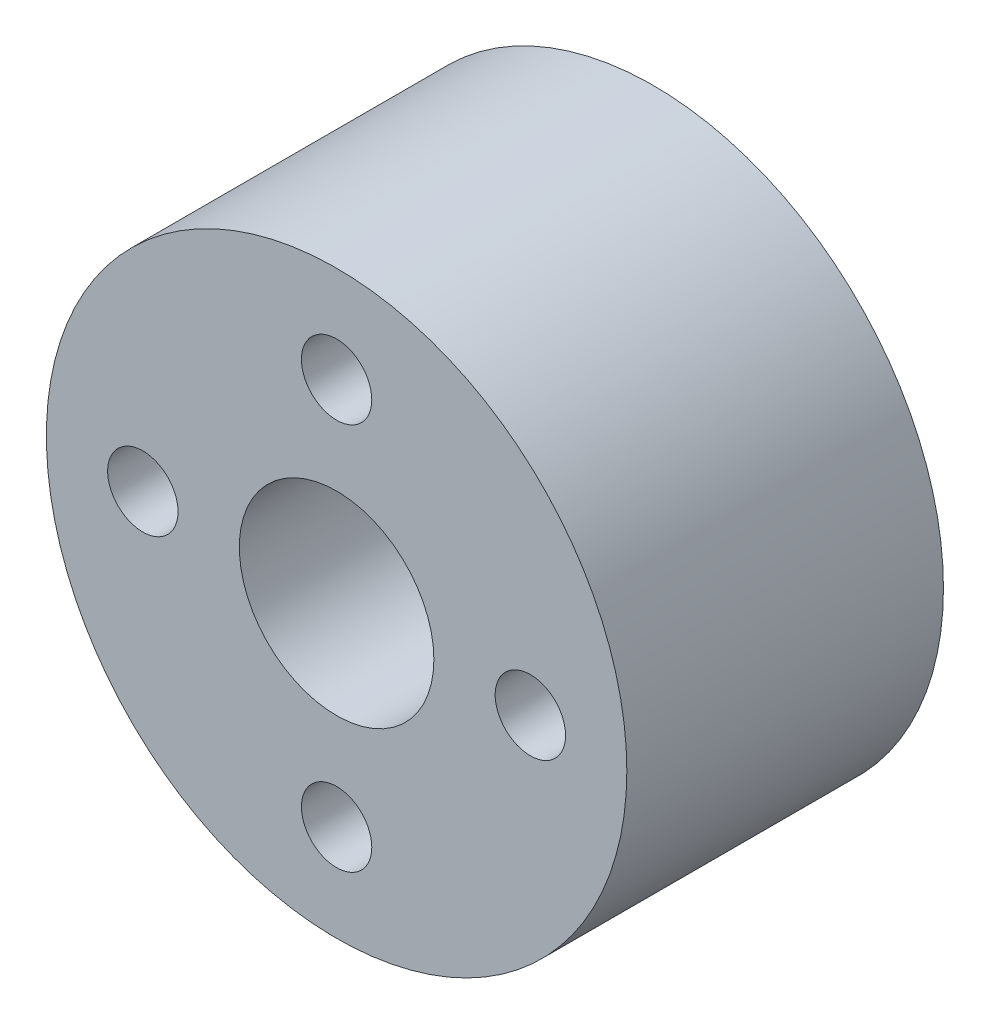
ISO-10303-21;
HEADER;
FILE_DESCRIPTION(('STEP AP214'),'2;1');
FILE_NAME('part.step','',(''),(''),'','','');
FILE_SCHEMA(('AUTOMOTIVE_DESIGN { 1 0 10303 214 1 1 1 1 }'));
ENDSEC;
DATA;
#1=APPLICATION_CONTEXT('core data for automotive mechanical design processes');
#2=APPLICATION_PROTOCOL_DEFINITION('international standard','automotive_design',2000,#1);
#3=PRODUCT_CONTEXT('',#1,'mechanical');
#4=PRODUCT('Part','Part','',(#3));
#5=PRODUCT_RELATED_PRODUCT_CATEGORY('part','',(#4));
#6=PRODUCT_DEFINITION_FORMATION('','',#4);
#7=PRODUCT_DEFINITION_CONTEXT('part definition',#1,'design');
#8=PRODUCT_DEFINITION('design','',#6,#7);
#9=PRODUCT_DEFINITION_SHAPE('','',#8);
#10=(LENGTH_UNIT() NAMED_UNIT(*) SI_UNIT(.MILLI.,.METRE.));
#11=(NAMED_UNIT(*) PLANE_ANGLE_UNIT() SI_UNIT($,.RADIAN.));
#12=(NAMED_UNIT(*) SI_UNIT($,.STERADIAN.) SOLID_ANGLE_UNIT());
#13=UNCERTAINTY_MEASURE_WITH_UNIT(LENGTH_MEASURE(1.E-05),#10,'distance_accuracy_value','');
#14=(GEOMETRIC_REPRESENTATION_CONTEXT(3) GLOBAL_UNCERTAINTY_ASSIGNED_CONTEXT((#13)) GLOBAL_UNIT_ASSIGNED_CONTEXT((#10,
#11,#12)) REPRESENTATION_CONTEXT('',''));
#15=CARTESIAN_POINT('',(0.,0.,0.));
#16=DIRECTION('',(0.,0.,1.));
#17=DIRECTION('',(1.,0.,0.));
#18=AXIS2_PLACEMENT_3D('',#15,#16,#17);
#19=CARTESIAN_POINT('',(0.,0.,-38.1));
#20=DIRECTION('',(0.,0.,1.));
#21=DIRECTION('',(1.,0.,0.));
#22=AXIS2_PLACEMENT_3D('',#19,#20,#21);
#23=CYLINDRICAL_SURFACE('',#22,69.85);
#24=CARTESIAN_POINT('',(0.,0.,-38.1));
#25=DIRECTION('',(0.,0.,1.));
#26=DIRECTION('',(1.,0.,0.));
#27=AXIS2_PLACEMENT_3D('',#24,#25,#26);
#28=CIRCLE('',#27,69.85);
#29=CARTESIAN_POINT('',(69.85,0.,-38.1));
#30=VERTEX_POINT('',#29);
#31=EDGE_CURVE('E12',#30,#30,#28,.T.);
#32=CARTESIAN_POINT('',(0.,0.,38.1));
#33=DIRECTION('',(0.,0.,1.));
#34=DIRECTION('',(1.,0.,0.));
#35=AXIS2_PLACEMENT_3D('',#32,#33,#34);
#36=CIRCLE('',#35,69.85);
#37=CARTESIAN_POINT('',(69.85,0.,38.1));
#38=VERTEX_POINT('',#37);
#39=EDGE_CURVE('E65',#38,#38,#36,.T.);
#40=CARTESIAN_POINT('',(69.85,0.,-38.1));
#41=CARTESIAN_POINT('',(69.85,0.,-37.30625));
#42=CARTESIAN_POINT('',(69.85,0.,-36.5125));
#43=CARTESIAN_POINT('',(69.85,0.,-34.925));
#44=CARTESIAN_POINT('',(69.85,0.,-34.13125));
#45=CARTESIAN_POINT('',(69.85,0.,-32.54375));
#46=CARTESIAN_POINT('',(69.85,0.,-31.75));
#47=CARTESIAN_POINT('',(69.85,0.,-30.1625));
#48=CARTESIAN_POINT('',(69.85,0.,-29.36875));
#49=CARTESIAN_POINT('',(69.85,0.,-27.78125));
#50=CARTESIAN_POINT('',(69.85,0.,-26.9875));
#51=CARTESIAN_POINT('',(69.85,0.,-25.4));
#52=CARTESIAN_POINT('',(69.85,0.,-24.60625));
#53=CARTESIAN_POINT('',(69.85,0.,-23.01875));
#54=CARTESIAN_POINT('',(69.85,0.,-22.225));
#55=CARTESIAN_POINT('',(69.85,0.,-20.6375));
#56=CARTESIAN_POINT('',(69.85,0.,-19.84375));
#57=CARTESIAN_POINT('',(69.85,0.,-18.25625));
#58=CARTESIAN_POINT('',(69.85,0.,-17.4625));
#59=CARTESIAN_POINT('',(69.85,0.,-15.875));
#60=CARTESIAN_POINT('',(69.85,0.,-15.08125));
#61=CARTESIAN_POINT('',(69.85,0.,-13.49375));
#62=CARTESIAN_POINT('',(69.85,0.,-12.7));
#63=CARTESIAN_POINT('',(69.85,0.,-11.1125));
#64=CARTESIAN_POINT('',(69.85,0.,-10.31875));
#65=CARTESIAN_POINT('',(69.85,0.,-8.73125));
#66=CARTESIAN_POINT('',(69.85,0.,-7.9375));
#67=CARTESIAN_POINT('',(69.85,0.,-6.35));
#68=CARTESIAN_POINT('',(69.85,0.,-5.55625000000001));
#69=CARTESIAN_POINT('',(69.85,0.,-3.96875000000001));
#70=CARTESIAN_POINT('',(69.85,0.,-3.17500000000001));
#71=CARTESIAN_POINT('',(69.85,0.,-1.58750000000001));
#72=CARTESIAN_POINT('',(69.85,0.,-0.793750000000007));
#73=CARTESIAN_POINT('',(69.85,0.,0.793749999999994));
#74=CARTESIAN_POINT('',(69.85,0.,1.58749999999999));
#75=CARTESIAN_POINT('',(69.85,0.,3.17499999999999));
#76=CARTESIAN_POINT('',(69.85,0.,3.96875));
#77=CARTESIAN_POINT('',(69.85,0.,5.55625));
#78=CARTESIAN_POINT('',(69.85,0.,6.35));
#79=CARTESIAN_POINT('',(69.85,0.,7.9375));
#80=CARTESIAN_POINT('',(69.85,0.,8.73125));
#81=CARTESIAN_POINT('',(69.85,0.,10.31875));
#82=CARTESIAN_POINT('',(69.85,0.,11.1125));
#83=CARTESIAN_POINT('',(69.85,0.,12.7));
#84=CARTESIAN_POINT('',(69.85,0.,13.49375));
#85=CARTESIAN_POINT('',(69.85,0.,15.08125));
#86=CARTESIAN_POINT('',(69.85,0.,15.875));
#87=CARTESIAN_POINT('',(69.85,0.,17.4625));
#88=CARTESIAN_POINT('',(69.85,0.,18.25625));
#89=CARTESIAN_POINT('',(69.85,0.,19.84375));
#90=CARTESIAN_POINT('',(69.85,0.,20.6375));
#91=CARTESIAN_POINT('',(69.85,0.,22.225));
#92=CARTESIAN_POINT('',(69.85,0.,23.01875));
#93=CARTESIAN_POINT('',(69.85,0.,24.60625));
#94=CARTESIAN_POINT('',(69.85,0.,25.4));
#95=CARTESIAN_POINT('',(69.85,0.,26.9875));
#96=CARTESIAN_POINT('',(69.85,0.,27.78125));
#97=CARTESIAN_POINT('',(69.85,0.,29.36875));
#98=CARTESIAN_POINT('',(69.85,0.,30.1625));
#99=CARTESIAN_POINT('',(69.85,0.,31.75));
#100=CARTESIAN_POINT('',(69.85,0.,32.54375));
#101=CARTESIAN_POINT('',(69.85,0.,34.13125));
#102=CARTESIAN_POINT('',(69.85,0.,34.925));
#103=CARTESIAN_POINT('',(69.85,0.,36.5125));
#104=CARTESIAN_POINT('',(69.85,0.,37.30625));
#105=CARTESIAN_POINT('',(69.85,0.,38.1));
#106=B_SPLINE_CURVE_WITH_KNOTS('',3,(#40,#41,#42,#43,#44,#45,#46,#47,#48,#49,#50,#51,#52,#53,
#54,#55,#56,#57,#58,#59,#60,#61,#62,#63,#64,#65,#66,#67,#68,#69,#70,#71,#72,#73,#74,#75,#76,#77,
#78,#79,#80,#81,#82,#83,#84,#85,#86,#87,#88,#89,#90,#91,#92,#93,#94,#95,#96,#97,#98,#99,#100,
#101,#102,#103,#104,#105),.UNSPECIFIED.,.F.,.F.,(4,2,2,2,2,2,2,2,2,2,2,2,2,2,2,2,2,2,2,2,2,2,2,
2,2,2,2,2,2,2,2,2,4),(0.,2.38125,4.7625,7.14375,9.52500000000001,11.90625,14.2875,16.66875,
19.05,21.43125,23.8125,26.19375,28.575,30.95625,33.3375,35.71875,38.1,40.48125,42.8625,45.24375,
47.625,50.00625,52.3875,54.76875,57.15,59.53125,61.9125,64.29375,66.675,69.05625,71.4375,
73.81875,76.2),.UNSPECIFIED.);
#107=EDGE_CURVE('BSEAM40',#30,#38,#106,.T.);
#108=ORIENTED_EDGE('',*,*,#31,.T.);
#109=ORIENTED_EDGE('',*,*,#39,.F.);
#110=ORIENTED_EDGE('',*,*,#107,.T.);
#111=ORIENTED_EDGE('',*,*,#107,.F.);
#112=EDGE_LOOP('',(#108,#110,#109,#111));
#113=FACE_BOUND('',#112,.T.);
#114=ADVANCED_FACE('F40',(#113),#23,.T.);
#115=CARTESIAN_POINT('',(0.,0.,-38.1));
#116=DIRECTION('',(0.,0.,1.));
#117=DIRECTION('',(1.,0.,0.));
#118=AXIS2_PLACEMENT_3D('',#115,#116,#117);
#119=PLANE('',#118);
#120=CARTESIAN_POINT('',(-4.74992845568246E-13,-46.631301073,-38.1));
#121=DIRECTION('',(0.,0.,1.));
#122=DIRECTION('',(1.,0.,0.));
#123=AXIS2_PLACEMENT_3D('',#120,#121,#122);
#124=CIRCLE('',#123,8.46666666666666);
#125=CARTESIAN_POINT('',(8.46666666666619,-46.631301073,-38.1));
#126=VERTEX_POINT('',#125);
#127=EDGE_CURVE('E62',#126,#126,#124,.T.);
#128=ORIENTED_EDGE('',*,*,#127,.T.);
#129=EDGE_LOOP('',(#128));
#130=FACE_BOUND('',#129,.T.);
#131=CARTESIAN_POINT('',(46.631301073,-3.1218052806589E-13,-38.1));
#132=DIRECTION('',(0.,0.,1.));
#133=DIRECTION('',(1.,0.,0.));
#134=AXIS2_PLACEMENT_3D('',#131,#132,#133);
#135=CIRCLE('',#134,8.46666666666666);
#136=CARTESIAN_POINT('',(55.0979677396667,-3.1218052806589E-13,-38.1));
#137=VERTEX_POINT('',#136);
#138=EDGE_CURVE('E59',#137,#137,#135,.T.);
#139=ORIENTED_EDGE('',*,*,#138,.T.);
#140=EDGE_LOOP('',(#139));
#141=FACE_BOUND('',#140,.T.);
#142=CARTESIAN_POINT('',(1.56307104467442E-13,46.631301073,-38.1));
#143=DIRECTION('',(0.,0.,1.));
#144=DIRECTION('',(1.,0.,0.));
#145=AXIS2_PLACEMENT_3D('',#142,#143,#144);
#146=CIRCLE('',#145,8.46666666666666);
#147=CARTESIAN_POINT('',(8.46666666666681,46.631301073,-38.1));
#148=VERTEX_POINT('',#147);
#149=EDGE_CURVE('E54',#148,#148,#146,.T.);
#150=ORIENTED_EDGE('',*,*,#149,.T.);
#151=EDGE_LOOP('',(#150));
#152=FACE_BOUND('',#151,.T.);
#153=CARTESIAN_POINT('',(-46.631301073,0.,-38.1));
#154=DIRECTION('',(0.,0.,1.));
#155=DIRECTION('',(1.,0.,0.));
#156=AXIS2_PLACEMENT_3D('',#153,#154,#155);
#157=CIRCLE('',#156,8.46666666666666);
#158=CARTESIAN_POINT('',(-38.1646344063333,0.,-38.1));
#159=VERTEX_POINT('',#158);
#160=EDGE_CURVE('E50',#159,#159,#157,.T.);
#161=ORIENTED_EDGE('',*,*,#160,.T.);
#162=EDGE_LOOP('',(#161));
#163=FACE_BOUND('',#162,.T.);
#164=CARTESIAN_POINT('',(0.,0.,-38.1));
#165=DIRECTION('',(0.,0.,1.));
#166=DIRECTION('',(1.,0.,0.));
#167=AXIS2_PLACEMENT_3D('',#164,#165,#166);
#168=CIRCLE('',#167,23.412602146);
#169=CARTESIAN_POINT('',(23.412602146,0.,-38.1));
#170=VERTEX_POINT('',#169);
#171=EDGE_CURVE('E46',#170,#170,#168,.T.);
#172=ORIENTED_EDGE('',*,*,#171,.T.);
#173=EDGE_LOOP('',(#172));
#174=FACE_BOUND('',#173,.T.);
#175=ORIENTED_EDGE('',*,*,#31,.F.);
#176=EDGE_LOOP('',(#175));
#177=FACE_BOUND('',#176,.T.);
#178=ADVANCED_FACE('F99',(#130,#141,#152,#163,#174,#177),#119,.F.);
#179=CARTESIAN_POINT('',(0.,0.,-38.1));
#180=DIRECTION('',(0.,0.,1.));
#181=DIRECTION('',(1.,0.,0.));
#182=AXIS2_PLACEMENT_3D('',#179,#180,#181);
#183=CYLINDRICAL_SURFACE('',#182,23.412602146);
#184=CARTESIAN_POINT('',(0.,0.,38.1));
#185=DIRECTION('',(0.,0.,1.));
#186=DIRECTION('',(1.,0.,0.));
#187=AXIS2_PLACEMENT_3D('',#184,#185,#186);
#188=CIRCLE('',#187,23.412602146);
#189=CARTESIAN_POINT('',(23.412602146,0.,38.1));
#190=VERTEX_POINT('',#189);
#191=EDGE_CURVE('E68',#190,#190,#188,.T.);
#192=CARTESIAN_POINT('',(23.412602146,0.,-38.1));
#193=CARTESIAN_POINT('',(23.412602146,0.,-37.30625));
#194=CARTESIAN_POINT('',(23.412602146,0.,-36.5125));
#195=CARTESIAN_POINT('',(23.412602146,0.,-34.925));
#196=CARTESIAN_POINT('',(23.412602146,0.,-34.13125));
#197=CARTESIAN_POINT('',(23.412602146,0.,-32.54375));
#198=CARTESIAN_POINT('',(23.412602146,0.,-31.75));
#199=CARTESIAN_POINT('',(23.412602146,0.,-30.1625));
#200=CARTESIAN_POINT('',(23.412602146,0.,-29.36875));
#201=CARTESIAN_POINT('',(23.412602146,0.,-27.78125));
#202=CARTESIAN_POINT('',(23.412602146,0.,-26.9875));
#203=CARTESIAN_POINT('',(23.412602146,0.,-25.4));
#204=CARTESIAN_POINT('',(23.412602146,0.,-24.60625));
#205=CARTESIAN_POINT('',(23.412602146,0.,-23.01875));
#206=CARTESIAN_POINT('',(23.412602146,0.,-22.225));
#207=CARTESIAN_POINT('',(23.412602146,0.,-20.6375));
#208=CARTESIAN_POINT('',(23.412602146,0.,-19.84375));
#209=CARTESIAN_POINT('',(23.412602146,0.,-18.25625));
#210=CARTESIAN_POINT('',(23.412602146,0.,-17.4625));
#211=CARTESIAN_POINT('',(23.412602146,0.,-15.875));
#212=CARTESIAN_POINT('',(23.412602146,0.,-15.08125));
#213=CARTESIAN_POINT('',(23.412602146,0.,-13.49375));
#214=CARTESIAN_POINT('',(23.412602146,0.,-12.7));
#215=CARTESIAN_POINT('',(23.412602146,0.,-11.1125));
#216=CARTESIAN_POINT('',(23.412602146,0.,-10.31875));
#217=CARTESIAN_POINT('',(23.412602146,0.,-8.73125));
#218=CARTESIAN_POINT('',(23.412602146,0.,-7.9375));
#219=CARTESIAN_POINT('',(23.412602146,0.,-6.35));
#220=CARTESIAN_POINT('',(23.412602146,0.,-5.55625));
#221=CARTESIAN_POINT('',(23.412602146,0.,-3.96875));
#222=CARTESIAN_POINT('',(23.412602146,0.,-3.175));
#223=CARTESIAN_POINT('',(23.412602146,0.,-1.5875));
#224=CARTESIAN_POINT('',(23.412602146,0.,-0.793750000000001));
#225=CARTESIAN_POINT('',(23.412602146,0.,0.793750000000001));
#226=CARTESIAN_POINT('',(23.412602146,0.,1.5875));
#227=CARTESIAN_POINT('',(23.412602146,0.,3.175));
#228=CARTESIAN_POINT('',(23.412602146,0.,3.96875));
#229=CARTESIAN_POINT('',(23.412602146,0.,5.55625));
#230=CARTESIAN_POINT('',(23.412602146,0.,6.35));
#231=CARTESIAN_POINT('',(23.412602146,0.,7.93750000000001));
#232=CARTESIAN_POINT('',(23.412602146,0.,8.73125));
#233=CARTESIAN_POINT('',(23.412602146,0.,10.31875));
#234=CARTESIAN_POINT('',(23.412602146,0.,11.1125));
#235=CARTESIAN_POINT('',(23.412602146,0.,12.7));
#236=CARTESIAN_POINT('',(23.412602146,0.,13.49375));
#237=CARTESIAN_POINT('',(23.412602146,0.,15.08125));
#238=CARTESIAN_POINT('',(23.412602146,0.,15.875));
#239=CARTESIAN_POINT('',(23.412602146,0.,17.4625));
#240=CARTESIAN_POINT('',(23.412602146,0.,18.25625));
#241=CARTESIAN_POINT('',(23.412602146,0.,19.84375));
#242=CARTESIAN_POINT('',(23.412602146,0.,20.6375));
#243=CARTESIAN_POINT('',(23.412602146,0.,22.225));
#244=CARTESIAN_POINT('',(23.412602146,0.,23.01875));
#245=CARTESIAN_POINT('',(23.412602146,0.,24.60625));
#246=CARTESIAN_POINT('',(23.412602146,0.,25.4));
#247=CARTESIAN_POINT('',(23.412602146,0.,26.9875));
#248=CARTESIAN_POINT('',(23.412602146,0.,27.78125));
#249=CARTESIAN_POINT('',(23.412602146,0.,29.36875));
#250=CARTESIAN_POINT('',(23.412602146,0.,30.1625));
#251=CARTESIAN_POINT('',(23.412602146,0.,31.75));
#252=CARTESIAN_POINT('',(23.412602146,0.,32.54375));
#253=CARTESIAN_POINT('',(23.412602146,0.,34.13125));
#254=CARTESIAN_POINT('',(23.412602146,0.,34.925));
#255=CARTESIAN_POINT('',(23.412602146,0.,36.5125));
#256=CARTESIAN_POINT('',(23.412602146,0.,37.30625));
#257=CARTESIAN_POINT('',(23.412602146,0.,38.1));
#258=B_SPLINE_CURVE_WITH_KNOTS('',3,(#192,#193,#194,#195,#196,#197,#198,#199,#200,#201,#202,
#203,#204,#205,#206,#207,#208,#209,#210,#211,#212,#213,#214,#215,#216,#217,#218,#219,#220,#221,
#222,#223,#224,#225,#226,#227,#228,#229,#230,#231,#232,#233,#234,#235,#236,#237,#238,#239,#240,
#241,#242,#243,#244,#245,#246,#247,#248,#249,#250,#251,#252,#253,#254,#255,#256,#257),
.UNSPECIFIED.,.F.,.F.,(4,2,2,2,2,2,2,2,2,2,2,2,2,2,2,2,2,2,2,2,2,2,2,2,2,2,2,2,2,2,2,2,4),(0.,
2.38124999999999,4.7625,7.14375,9.525,11.90625,14.2875,16.66875,19.05,21.43125,23.8125,26.19375,
28.575,30.95625,33.3375,35.71875,38.1,40.48125,42.8625,45.24375,47.625,50.00625,52.3875,
54.76875,57.15,59.53125,61.9125,64.29375,66.675,69.05625,71.4375,73.81875,76.2),.UNSPECIFIED.);
#259=EDGE_CURVE('BSEAM103',#170,#190,#258,.T.);
#260=ORIENTED_EDGE('',*,*,#171,.F.);
#261=ORIENTED_EDGE('',*,*,#191,.T.);
#262=ORIENTED_EDGE('',*,*,#259,.T.);
#263=ORIENTED_EDGE('',*,*,#259,.F.);
#264=EDGE_LOOP('',(#260,#262,#261,#263));
#265=FACE_BOUND('',#264,.T.);
#266=ADVANCED_FACE('F103',(#265),#183,.F.);
#267=CARTESIAN_POINT('',(-46.631301073,0.,-38.1));
#268=DIRECTION('',(0.,0.,1.));
#269=DIRECTION('',(1.,0.,0.));
#270=AXIS2_PLACEMENT_3D('',#267,#268,#269);
#271=CYLINDRICAL_SURFACE('',#270,8.46666666666666);
#272=CARTESIAN_POINT('',(-46.631301073,0.,38.1));
#273=DIRECTION('',(0.,0.,1.));
#274=DIRECTION('',(1.,0.,0.));
#275=AXIS2_PLACEMENT_3D('',#272,#273,#274);
#276=CIRCLE('',#275,8.46666666666666);
#277=CARTESIAN_POINT('',(-38.1646344063333,0.,38.1));
#278=VERTEX_POINT('',#277);
#279=EDGE_CURVE('E71',#278,#278,#276,.T.);
#280=CARTESIAN_POINT('',(-38.1646344063333,0.,-38.1));
#281=CARTESIAN_POINT('',(-38.1646344063333,0.,-37.30625));
#282=CARTESIAN_POINT('',(-38.1646344063333,0.,-36.5125));
#283=CARTESIAN_POINT('',(-38.1646344063333,0.,-34.925));
#284=CARTESIAN_POINT('',(-38.1646344063333,0.,-34.13125));
#285=CARTESIAN_POINT('',(-38.1646344063333,0.,-32.54375));
#286=CARTESIAN_POINT('',(-38.1646344063333,0.,-31.75));
#287=CARTESIAN_POINT('',(-38.1646344063333,0.,-30.1625));
#288=CARTESIAN_POINT('',(-38.1646344063333,0.,-29.36875));
#289=CARTESIAN_POINT('',(-38.1646344063333,0.,-27.78125));
#290=CARTESIAN_POINT('',(-38.1646344063333,0.,-26.9875));
#291=CARTESIAN_POINT('',(-38.1646344063333,0.,-25.4));
#292=CARTESIAN_POINT('',(-38.1646344063333,0.,-24.60625));
#293=CARTESIAN_POINT('',(-38.1646344063333,0.,-23.01875));
#294=CARTESIAN_POINT('',(-38.1646344063333,0.,-22.225));
#295=CARTESIAN_POINT('',(-38.1646344063333,0.,-20.6375));
#296=CARTESIAN_POINT('',(-38.1646344063333,0.,-19.84375));
#297=CARTESIAN_POINT('',(-38.1646344063333,0.,-18.25625));
#298=CARTESIAN_POINT('',(-38.1646344063333,0.,-17.4625));
#299=CARTESIAN_POINT('',(-38.1646344063333,0.,-15.875));
#300=CARTESIAN_POINT('',(-38.1646344063333,0.,-15.08125));
#301=CARTESIAN_POINT('',(-38.1646344063333,0.,-13.49375));
#302=CARTESIAN_POINT('',(-38.1646344063333,0.,-12.7));
#303=CARTESIAN_POINT('',(-38.1646344063333,0.,-11.1125));
#304=CARTESIAN_POINT('',(-38.1646344063333,0.,-10.31875));
#305=CARTESIAN_POINT('',(-38.1646344063333,0.,-8.73125));
#306=CARTESIAN_POINT('',(-38.1646344063333,0.,-7.9375));
#307=CARTESIAN_POINT('',(-38.1646344063333,0.,-6.35));
#308=CARTESIAN_POINT('',(-38.1646344063333,0.,-5.55625000000001));
#309=CARTESIAN_POINT('',(-38.1646344063333,0.,-3.96875000000001));
#310=CARTESIAN_POINT('',(-38.1646344063333,0.,-3.17500000000001));
#311=CARTESIAN_POINT('',(-38.1646344063333,0.,-1.58750000000001));
#312=CARTESIAN_POINT('',(-38.1646344063333,0.,-0.793750000000007));
#313=CARTESIAN_POINT('',(-38.1646344063333,0.,0.793749999999994));
#314=CARTESIAN_POINT('',(-38.1646344063333,0.,1.58749999999999));
#315=CARTESIAN_POINT('',(-38.1646344063333,0.,3.17499999999999));
#316=CARTESIAN_POINT('',(-38.1646344063333,0.,3.96875));
#317=CARTESIAN_POINT('',(-38.1646344063333,0.,5.55625));
#318=CARTESIAN_POINT('',(-38.1646344063333,0.,6.35));
#319=CARTESIAN_POINT('',(-38.1646344063333,0.,7.9375));
#320=CARTESIAN_POINT('',(-38.1646344063333,0.,8.73125));
#321=CARTESIAN_POINT('',(-38.1646344063333,0.,10.31875));
#322=CARTESIAN_POINT('',(-38.1646344063333,0.,11.1125));
#323=CARTESIAN_POINT('',(-38.1646344063333,0.,12.7));
#324=CARTESIAN_POINT('',(-38.1646344063333,0.,13.49375));
#325=CARTESIAN_POINT('',(-38.1646344063333,0.,15.08125));
#326=CARTESIAN_POINT('',(-38.1646344063333,0.,15.875));
#327=CARTESIAN_POINT('',(-38.1646344063333,0.,17.4625));
#328=CARTESIAN_POINT('',(-38.1646344063333,0.,18.25625));
#329=CARTESIAN_POINT('',(-38.1646344063333,0.,19.84375));
#330=CARTESIAN_POINT('',(-38.1646344063333,0.,20.6375));
#331=CARTESIAN_POINT('',(-38.1646344063333,0.,22.225));
#332=CARTESIAN_POINT('',(-38.1646344063333,0.,23.01875));
#333=CARTESIAN_POINT('',(-38.1646344063333,0.,24.60625));
#334=CARTESIAN_POINT('',(-38.1646344063333,0.,25.4));
#335=CARTESIAN_POINT('',(-38.1646344063333,0.,26.9875));
#336=CARTESIAN_POINT('',(-38.1646344063333,0.,27.78125));
#337=CARTESIAN_POINT('',(-38.1646344063333,0.,29.36875));
#338=CARTESIAN_POINT('',(-38.1646344063333,0.,30.1625));
#339=CARTESIAN_POINT('',(-38.1646344063333,0.,31.75));
#340=CARTESIAN_POINT('',(-38.1646344063333,0.,32.54375));
#341=CARTESIAN_POINT('',(-38.1646344063333,0.,34.13125));
#342=CARTESIAN_POINT('',(-38.1646344063333,0.,34.925));
#343=CARTESIAN_POINT('',(-38.1646344063333,0.,36.5125));
#344=CARTESIAN_POINT('',(-38.1646344063333,0.,37.30625));
#345=CARTESIAN_POINT('',(-38.1646344063333,0.,38.1));
#346=B_SPLINE_CURVE_WITH_KNOTS('',3,(#280,#281,#282,#283,#284,#285,#286,#287,#288,#289,#290,
#291,#292,#293,#294,#295,#296,#297,#298,#299,#300,#301,#302,#303,#304,#305,#306,#307,#308,#309,
#310,#311,#312,#313,#314,#315,#316,#317,#318,#319,#320,#321,#322,#323,#324,#325,#326,#327,#328,
#329,#330,#331,#332,#333,#334,#335,#336,#337,#338,#339,#340,#341,#342,#343,#344,#345),
.UNSPECIFIED.,.F.,.F.,(4,2,2,2,2,2,2,2,2,2,2,2,2,2,2,2,2,2,2,2,2,2,2,2,2,2,2,2,2,2,2,2,4),(0.,
2.38125,4.7625,7.14375,9.52500000000001,11.90625,14.2875,16.66875,19.05,21.43125,23.8125,
26.19375,28.575,30.95625,33.3375,35.71875,38.1,40.48125,42.8625,45.24375,47.625,50.00625,
52.3875,54.76875,57.15,59.53125,61.9125,64.29375,66.675,69.05625,71.4375,73.81875,76.2),.UNSPECIFIED.);
#347=EDGE_CURVE('BSEAM115',#159,#278,#346,.T.);
#348=ORIENTED_EDGE('',*,*,#160,.F.);
#349=ORIENTED_EDGE('',*,*,#279,.T.);
#350=ORIENTED_EDGE('',*,*,#347,.T.);
#351=ORIENTED_EDGE('',*,*,#347,.F.);
#352=EDGE_LOOP('',(#348,#350,#349,#351));
#353=FACE_BOUND('',#352,.T.);
#354=ADVANCED_FACE('F115',(#353),#271,.F.);
#355=CARTESIAN_POINT('',(1.56307104467442E-13,46.631301073,-38.1));
#356=DIRECTION('',(0.,0.,1.));
#357=DIRECTION('',(1.,0.,0.));
#358=AXIS2_PLACEMENT_3D('',#355,#356,#357);
#359=CYLINDRICAL_SURFACE('',#358,8.46666666666666);
#360=CARTESIAN_POINT('',(1.56307104467442E-13,46.631301073,38.1));
#361=DIRECTION('',(0.,0.,1.));
#362=DIRECTION('',(1.,0.,0.));
#363=AXIS2_PLACEMENT_3D('',#360,#361,#362);
#364=CIRCLE('',#363,8.46666666666666);
#365=CARTESIAN_POINT('',(8.46666666666681,46.631301073,38.1));
#366=VERTEX_POINT('',#365);
#367=EDGE_CURVE('E74',#366,#366,#364,.T.);
#368=CARTESIAN_POINT('',(8.46666666666681,46.631301073,-38.1));
#369=CARTESIAN_POINT('',(8.46666666666681,46.631301073,-37.30625));
#370=CARTESIAN_POINT('',(8.46666666666681,46.631301073,-36.5125));
#371=CARTESIAN_POINT('',(8.46666666666681,46.631301073,-34.925));
#372=CARTESIAN_POINT('',(8.46666666666681,46.631301073,-34.13125));
#373=CARTESIAN_POINT('',(8.46666666666681,46.631301073,-32.54375));
#374=CARTESIAN_POINT('',(8.46666666666681,46.631301073,-31.75));
#375=CARTESIAN_POINT('',(8.46666666666681,46.631301073,-30.1625));
#376=CARTESIAN_POINT('',(8.46666666666681,46.631301073,-29.36875));
#377=CARTESIAN_POINT('',(8.46666666666681,46.631301073,-27.78125));
#378=CARTESIAN_POINT('',(8.46666666666681,46.631301073,-26.9875));
#379=CARTESIAN_POINT('',(8.46666666666681,46.631301073,-25.4));
#380=CARTESIAN_POINT('',(8.46666666666681,46.631301073,-24.60625));
#381=CARTESIAN_POINT('',(8.46666666666681,46.631301073,-23.01875));
#382=CARTESIAN_POINT('',(8.46666666666681,46.631301073,-22.225));
#383=CARTESIAN_POINT('',(8.46666666666681,46.631301073,-20.6375));
#384=CARTESIAN_POINT('',(8.46666666666681,46.631301073,-19.84375));
#385=CARTESIAN_POINT('',(8.46666666666681,46.631301073,-18.25625));
#386=CARTESIAN_POINT('',(8.46666666666681,46.631301073,-17.4625));
#387=CARTESIAN_POINT('',(8.46666666666681,46.631301073,-15.875));
#388=CARTESIAN_POINT('',(8.46666666666681,46.631301073,-15.08125));
#389=CARTESIAN_POINT('',(8.46666666666681,46.631301073,-13.49375));
#390=CARTESIAN_POINT('',(8.46666666666681,46.631301073,-12.7));
#391=CARTESIAN_POINT('',(8.46666666666681,46.631301073,-11.1125));
#392=CARTESIAN_POINT('',(8.46666666666681,46.631301073,-10.31875));
#393=CARTESIAN_POINT('',(8.46666666666681,46.631301073,-8.73125));
#394=CARTESIAN_POINT('',(8.46666666666681,46.631301073,-7.9375));
#395=CARTESIAN_POINT('',(8.46666666666681,46.631301073,-6.35));
#396=CARTESIAN_POINT('',(8.46666666666681,46.631301073,-5.55625000000001));
#397=CARTESIAN_POINT('',(8.46666666666681,46.631301073,-3.96875000000001));
#398=CARTESIAN_POINT('',(8.46666666666681,46.631301073,-3.17500000000001));
#399=CARTESIAN_POINT('',(8.46666666666681,46.631301073,-1.58750000000001));
#400=CARTESIAN_POINT('',(8.46666666666681,46.631301073,-0.793750000000007));
#401=CARTESIAN_POINT('',(8.46666666666681,46.631301073,0.793749999999994));
#402=CARTESIAN_POINT('',(8.46666666666681,46.631301073,1.58749999999999));
#403=CARTESIAN_POINT('',(8.46666666666681,46.631301073,3.17499999999999));
#404=CARTESIAN_POINT('',(8.46666666666681,46.631301073,3.96875));
#405=CARTESIAN_POINT('',(8.46666666666681,46.631301073,5.55625));
#406=CARTESIAN_POINT('',(8.46666666666681,46.631301073,6.35));
#407=CARTESIAN_POINT('',(8.46666666666681,46.631301073,7.9375));
#408=CARTESIAN_POINT('',(8.46666666666681,46.631301073,8.73125));
#409=CARTESIAN_POINT('',(8.46666666666681,46.631301073,10.31875));
#410=CARTESIAN_POINT('',(8.46666666666681,46.631301073,11.1125));
#411=CARTESIAN_POINT('',(8.46666666666681,46.631301073,12.7));
#412=CARTESIAN_POINT('',(8.46666666666681,46.631301073,13.49375));
#413=CARTESIAN_POINT('',(8.46666666666681,46.631301073,15.08125));
#414=CARTESIAN_POINT('',(8.46666666666681,46.631301073,15.875));
#415=CARTESIAN_POINT('',(8.46666666666681,46.631301073,17.4625));
#416=CARTESIAN_POINT('',(8.46666666666681,46.631301073,18.25625));
#417=CARTESIAN_POINT('',(8.46666666666681,46.631301073,19.84375));
#418=CARTESIAN_POINT('',(8.46666666666681,46.631301073,20.6375));
#419=CARTESIAN_POINT('',(8.46666666666681,46.631301073,22.225));
#420=CARTESIAN_POINT('',(8.46666666666681,46.631301073,23.01875));
#421=CARTESIAN_POINT('',(8.46666666666681,46.631301073,24.60625));
#422=CARTESIAN_POINT('',(8.46666666666681,46.631301073,25.4));
#423=CARTESIAN_POINT('',(8.46666666666681,46.631301073,26.9875));
#424=CARTESIAN_POINT('',(8.46666666666681,46.631301073,27.78125));
#425=CARTESIAN_POINT('',(8.46666666666681,46.631301073,29.36875));
#426=CARTESIAN_POINT('',(8.46666666666681,46.631301073,30.1625));
#427=CARTESIAN_POINT('',(8.46666666666681,46.631301073,31.75));
#428=CARTESIAN_POINT('',(8.46666666666681,46.631301073,32.54375));
#429=CARTESIAN_POINT('',(8.46666666666681,46.631301073,34.13125));
#430=CARTESIAN_POINT('',(8.46666666666681,46.631301073,34.925));
#431=CARTESIAN_POINT('',(8.46666666666681,46.631301073,36.5125));
#432=CARTESIAN_POINT('',(8.46666666666681,46.631301073,37.30625));
#433=CARTESIAN_POINT('',(8.46666666666681,46.631301073,38.1));
#434=B_SPLINE_CURVE_WITH_KNOTS('',3,(#368,#369,#370,#371,#372,#373,#374,#375,#376,#377,#378,
#379,#380,#381,#382,#383,#384,#385,#386,#387,#388,#389,#390,#391,#392,#393,#394,#395,#396,#397,
#398,#399,#400,#401,#402,#403,#404,#405,#406,#407,#408,#409,#410,#411,#412,#413,#414,#415,#416,
#417,#418,#419,#420,#421,#422,#423,#424,#425,#426,#427,#428,#429,#430,#431,#432,#433),
.UNSPECIFIED.,.F.,.F.,(4,2,2,2,2,2,2,2,2,2,2,2,2,2,2,2,2,2,2,2,2,2,2,2,2,2,2,2,2,2,2,2,4),(0.,
2.38125,4.7625,7.14375,9.52500000000001,11.90625,14.2875,16.66875,19.05,21.43125,23.8125,
26.19375,28.575,30.95625,33.3375,35.71875,38.1,40.48125,42.8625,45.24375,47.625,50.00625,
52.3875,54.76875,57.15,59.53125,61.9125,64.29375,66.675,69.05625,71.4375,73.81875,76.2),.UNSPECIFIED.);
#435=EDGE_CURVE('BSEAM113',#148,#366,#434,.T.);
#436=ORIENTED_EDGE('',*,*,#149,.F.);
#437=ORIENTED_EDGE('',*,*,#367,.T.);
#438=ORIENTED_EDGE('',*,*,#435,.T.);
#439=ORIENTED_EDGE('',*,*,#435,.F.);
#440=EDGE_LOOP('',(#436,#438,#437,#439));
#441=FACE_BOUND('',#440,.T.);
#442=ADVANCED_FACE('F113',(#441),#359,.F.);
#443=CARTESIAN_POINT('',(46.631301073,-3.1218052806589E-13,-38.1));
#444=DIRECTION('',(0.,0.,1.));
#445=DIRECTION('',(1.,0.,0.));
#446=AXIS2_PLACEMENT_3D('',#443,#444,#445);
#447=CYLINDRICAL_SURFACE('',#446,8.46666666666666);
#448=CARTESIAN_POINT('',(46.631301073,-3.1218052806589E-13,38.1));
#449=DIRECTION('',(0.,0.,1.));
#450=DIRECTION('',(1.,0.,0.));
#451=AXIS2_PLACEMENT_3D('',#448,#449,#450);
#452=CIRCLE('',#451,8.46666666666666);
#453=CARTESIAN_POINT('',(55.0979677396667,-3.1218052806589E-13,38.1));
#454=VERTEX_POINT('',#453);
#455=EDGE_CURVE('E77',#454,#454,#452,.T.);
#456=CARTESIAN_POINT('',(55.0979677396667,-3.1218052806589E-13,-38.1));
#457=CARTESIAN_POINT('',(55.0979677396667,-3.1218052806589E-13,-37.30625));
#458=CARTESIAN_POINT('',(55.0979677396667,-3.1218052806589E-13,-36.5125));
#459=CARTESIAN_POINT('',(55.0979677396667,-3.1218052806589E-13,-34.925));
#460=CARTESIAN_POINT('',(55.0979677396667,-3.1218052806589E-13,-34.13125));
#461=CARTESIAN_POINT('',(55.0979677396667,-3.1218052806589E-13,-32.54375));
#462=CARTESIAN_POINT('',(55.0979677396667,-3.1218052806589E-13,-31.75));
#463=CARTESIAN_POINT('',(55.0979677396667,-3.1218052806589E-13,-30.1625));
#464=CARTESIAN_POINT('',(55.0979677396667,-3.1218052806589E-13,-29.36875));
#465=CARTESIAN_POINT('',(55.0979677396667,-3.1218052806589E-13,-27.78125));
#466=CARTESIAN_POINT('',(55.0979677396667,-3.1218052806589E-13,-26.9875));
#467=CARTESIAN_POINT('',(55.0979677396667,-3.1218052806589E-13,-25.4));
#468=CARTESIAN_POINT('',(55.0979677396667,-3.1218052806589E-13,-24.60625));
#469=CARTESIAN_POINT('',(55.0979677396667,-3.1218052806589E-13,-23.01875));
#470=CARTESIAN_POINT('',(55.0979677396667,-3.1218052806589E-13,-22.225));
#471=CARTESIAN_POINT('',(55.0979677396667,-3.1218052806589E-13,-20.6375));
#472=CARTESIAN_POINT('',(55.0979677396667,-3.1218052806589E-13,-19.84375));
#473=CARTESIAN_POINT('',(55.0979677396667,-3.1218052806589E-13,-18.25625));
#474=CARTESIAN_POINT('',(55.0979677396667,-3.1218052806589E-13,-17.4625));
#475=CARTESIAN_POINT('',(55.0979677396667,-3.1218052806589E-13,-15.875));
#476=CARTESIAN_POINT('',(55.0979677396667,-3.1218052806589E-13,-15.08125));
#477=CARTESIAN_POINT('',(55.0979677396667,-3.1218052806589E-13,-13.49375));
#478=CARTESIAN_POINT('',(55.0979677396667,-3.1218052806589E-13,-12.7));
#479=CARTESIAN_POINT('',(55.0979677396667,-3.1218052806589E-13,-11.1125));
#480=CARTESIAN_POINT('',(55.0979677396667,-3.1218052806589E-13,-10.31875));
#481=CARTESIAN_POINT('',(55.0979677396667,-3.1218052806589E-13,-8.73125));
#482=CARTESIAN_POINT('',(55.0979677396667,-3.1218052806589E-13,-7.9375));
#483=CARTESIAN_POINT('',(55.0979677396667,-3.1218052806589E-13,-6.35));
#484=CARTESIAN_POINT('',(55.0979677396667,-3.1218052806589E-13,-5.55625000000001));
#485=CARTESIAN_POINT('',(55.0979677396667,-3.1218052806589E-13,-3.96875000000001));
#486=CARTESIAN_POINT('',(55.0979677396667,-3.1218052806589E-13,-3.17500000000001));
#487=CARTESIAN_POINT('',(55.0979677396667,-3.1218052806589E-13,-1.58750000000001));
#488=CARTESIAN_POINT('',(55.0979677396667,-3.1218052806589E-13,-0.793750000000007));
#489=CARTESIAN_POINT('',(55.0979677396667,-3.1218052806589E-13,0.793749999999994));
#490=CARTESIAN_POINT('',(55.0979677396667,-3.1218052806589E-13,1.58749999999999));
#491=CARTESIAN_POINT('',(55.0979677396667,-3.1218052806589E-13,3.17499999999999));
#492=CARTESIAN_POINT('',(55.0979677396667,-3.1218052806589E-13,3.96875));
#493=CARTESIAN_POINT('',(55.0979677396667,-3.1218052806589E-13,5.55625));
#494=CARTESIAN_POINT('',(55.0979677396667,-3.1218052806589E-13,6.35));
#495=CARTESIAN_POINT('',(55.0979677396667,-3.1218052806589E-13,7.9375));
#496=CARTESIAN_POINT('',(55.0979677396667,-3.1218052806589E-13,8.73125));
#497=CARTESIAN_POINT('',(55.0979677396667,-3.1218052806589E-13,10.31875));
#498=CARTESIAN_POINT('',(55.0979677396667,-3.1218052806589E-13,11.1125));
#499=CARTESIAN_POINT('',(55.0979677396667,-3.1218052806589E-13,12.7));
#500=CARTESIAN_POINT('',(55.0979677396667,-3.1218052806589E-13,13.49375));
#501=CARTESIAN_POINT('',(55.0979677396667,-3.1218052806589E-13,15.08125));
#502=CARTESIAN_POINT('',(55.0979677396667,-3.1218052806589E-13,15.875));
#503=CARTESIAN_POINT('',(55.0979677396667,-3.1218052806589E-13,17.4625));
#504=CARTESIAN_POINT('',(55.0979677396667,-3.1218052806589E-13,18.25625));
#505=CARTESIAN_POINT('',(55.0979677396667,-3.1218052806589E-13,19.84375));
#506=CARTESIAN_POINT('',(55.0979677396667,-3.1218052806589E-13,20.6375));
#507=CARTESIAN_POINT('',(55.0979677396667,-3.1218052806589E-13,22.225));
#508=CARTESIAN_POINT('',(55.0979677396667,-3.1218052806589E-13,23.01875));
#509=CARTESIAN_POINT('',(55.0979677396667,-3.1218052806589E-13,24.60625));
#510=CARTESIAN_POINT('',(55.0979677396667,-3.1218052806589E-13,25.4));
#511=CARTESIAN_POINT('',(55.0979677396667,-3.1218052806589E-13,26.9875));
#512=CARTESIAN_POINT('',(55.0979677396667,-3.1218052806589E-13,27.78125));
#513=CARTESIAN_POINT('',(55.0979677396667,-3.1218052806589E-13,29.36875));
#514=CARTESIAN_POINT('',(55.0979677396667,-3.1218052806589E-13,30.1625));
#515=CARTESIAN_POINT('',(55.0979677396667,-3.1218052806589E-13,31.75));
#516=CARTESIAN_POINT('',(55.0979677396667,-3.1218052806589E-13,32.54375));
#517=CARTESIAN_POINT('',(55.0979677396667,-3.1218052806589E-13,34.13125));
#518=CARTESIAN_POINT('',(55.0979677396667,-3.1218052806589E-13,34.925));
#519=CARTESIAN_POINT('',(55.0979677396667,-3.1218052806589E-13,36.5125));
#520=CARTESIAN_POINT('',(55.0979677396667,-3.1218052806589E-13,37.30625));
#521=CARTESIAN_POINT('',(55.0979677396667,-3.1218052806589E-13,38.1));
#522=B_SPLINE_CURVE_WITH_KNOTS('',3,(#456,#457,#458,#459,#460,#461,#462,#463,#464,#465,#466,
#467,#468,#469,#470,#471,#472,#473,#474,#475,#476,#477,#478,#479,#480,#481,#482,#483,#484,#485,
#486,#487,#488,#489,#490,#491,#492,#493,#494,#495,#496,#497,#498,#499,#500,#501,#502,#503,#504,
#505,#506,#507,#508,#509,#510,#511,#512,#513,#514,#515,#516,#517,#518,#519,#520,#521),
.UNSPECIFIED.,.F.,.F.,(4,2,2,2,2,2,2,2,2,2,2,2,2,2,2,2,2,2,2,2,2,2,2,2,2,2,2,2,2,2,2,2,4),(0.,
2.38125,4.7625,7.14375,9.52500000000001,11.90625,14.2875,16.66875,19.05,21.43125,23.8125,
26.19375,28.575,30.95625,33.3375,35.71875,38.1,40.48125,42.8625,45.24375,47.625,50.00625,
52.3875,54.76875,57.15,59.53125,61.9125,64.29375,66.675,69.05625,71.4375,73.81875,76.2),.UNSPECIFIED.);
#523=EDGE_CURVE('BSEAM93',#137,#454,#522,.T.);
#524=ORIENTED_EDGE('',*,*,#138,.F.);
#525=ORIENTED_EDGE('',*,*,#455,.T.);
#526=ORIENTED_EDGE('',*,*,#523,.T.);
#527=ORIENTED_EDGE('',*,*,#523,.F.);
#528=EDGE_LOOP('',(#524,#526,#525,#527));
#529=FACE_BOUND('',#528,.T.);
#530=ADVANCED_FACE('F93',(#529),#447,.F.);
#531=CARTESIAN_POINT('',(-4.74992845568246E-13,-46.631301073,-38.1));
#532=DIRECTION('',(0.,0.,1.));
#533=DIRECTION('',(1.,0.,0.));
#534=AXIS2_PLACEMENT_3D('',#531,#532,#533);
#535=CYLINDRICAL_SURFACE('',#534,8.46666666666666);
#536=CARTESIAN_POINT('',(-4.74992845568246E-13,-46.631301073,38.1));
#537=DIRECTION('',(0.,0.,1.));
#538=DIRECTION('',(1.,0.,0.));
#539=AXIS2_PLACEMENT_3D('',#536,#537,#538);
#540=CIRCLE('',#539,8.46666666666666);
#541=CARTESIAN_POINT('',(8.46666666666619,-46.631301073,38.1));
#542=VERTEX_POINT('',#541);
#543=EDGE_CURVE('E80',#542,#542,#540,.T.);
#544=CARTESIAN_POINT('',(8.46666666666619,-46.631301073,-38.1));
#545=CARTESIAN_POINT('',(8.46666666666619,-46.631301073,-37.30625));
#546=CARTESIAN_POINT('',(8.46666666666619,-46.631301073,-36.5125));
#547=CARTESIAN_POINT('',(8.46666666666619,-46.631301073,-34.925));
#548=CARTESIAN_POINT('',(8.46666666666619,-46.631301073,-34.13125));
#549=CARTESIAN_POINT('',(8.46666666666619,-46.631301073,-32.54375));
#550=CARTESIAN_POINT('',(8.46666666666619,-46.631301073,-31.75));
#551=CARTESIAN_POINT('',(8.46666666666619,-46.631301073,-30.1625));
#552=CARTESIAN_POINT('',(8.46666666666619,-46.631301073,-29.36875));
#553=CARTESIAN_POINT('',(8.46666666666619,-46.631301073,-27.78125));
#554=CARTESIAN_POINT('',(8.46666666666619,-46.631301073,-26.9875));
#555=CARTESIAN_POINT('',(8.46666666666619,-46.631301073,-25.4));
#556=CARTESIAN_POINT('',(8.46666666666619,-46.631301073,-24.60625));
#557=CARTESIAN_POINT('',(8.46666666666619,-46.631301073,-23.01875));
#558=CARTESIAN_POINT('',(8.46666666666619,-46.631301073,-22.225));
#559=CARTESIAN_POINT('',(8.46666666666619,-46.631301073,-20.6375));
#560=CARTESIAN_POINT('',(8.46666666666619,-46.631301073,-19.84375));
#561=CARTESIAN_POINT('',(8.46666666666619,-46.631301073,-18.25625));
#562=CARTESIAN_POINT('',(8.46666666666619,-46.631301073,-17.4625));
#563=CARTESIAN_POINT('',(8.46666666666619,-46.631301073,-15.875));
#564=CARTESIAN_POINT('',(8.46666666666619,-46.631301073,-15.08125));
#565=CARTESIAN_POINT('',(8.46666666666619,-46.631301073,-13.49375));
#566=CARTESIAN_POINT('',(8.46666666666619,-46.631301073,-12.7));
#567=CARTESIAN_POINT('',(8.46666666666619,-46.631301073,-11.1125));
#568=CARTESIAN_POINT('',(8.46666666666619,-46.631301073,-10.31875));
#569=CARTESIAN_POINT('',(8.46666666666619,-46.631301073,-8.73125));
#570=CARTESIAN_POINT('',(8.46666666666619,-46.631301073,-7.9375));
#571=CARTESIAN_POINT('',(8.46666666666619,-46.631301073,-6.35));
#572=CARTESIAN_POINT('',(8.46666666666619,-46.631301073,-5.55625000000001));
#573=CARTESIAN_POINT('',(8.46666666666619,-46.631301073,-3.96875000000001));
#574=CARTESIAN_POINT('',(8.46666666666619,-46.631301073,-3.17500000000001));
#575=CARTESIAN_POINT('',(8.46666666666619,-46.631301073,-1.58750000000001));
#576=CARTESIAN_POINT('',(8.46666666666619,-46.631301073,-0.793750000000007));
#577=CARTESIAN_POINT('',(8.46666666666619,-46.631301073,0.793749999999994));
#578=CARTESIAN_POINT('',(8.46666666666619,-46.631301073,1.58749999999999));
#579=CARTESIAN_POINT('',(8.46666666666619,-46.631301073,3.17499999999999));
#580=CARTESIAN_POINT('',(8.46666666666619,-46.631301073,3.96875));
#581=CARTESIAN_POINT('',(8.46666666666619,-46.631301073,5.55625));
#582=CARTESIAN_POINT('',(8.46666666666619,-46.631301073,6.35));
#583=CARTESIAN_POINT('',(8.46666666666619,-46.631301073,7.9375));
#584=CARTESIAN_POINT('',(8.46666666666619,-46.631301073,8.73125));
#585=CARTESIAN_POINT('',(8.46666666666619,-46.631301073,10.31875));
#586=CARTESIAN_POINT('',(8.46666666666619,-46.631301073,11.1125));
#587=CARTESIAN_POINT('',(8.46666666666619,-46.631301073,12.7));
#588=CARTESIAN_POINT('',(8.46666666666619,-46.631301073,13.49375));
#589=CARTESIAN_POINT('',(8.46666666666619,-46.631301073,15.08125));
#590=CARTESIAN_POINT('',(8.46666666666619,-46.631301073,15.875));
#591=CARTESIAN_POINT('',(8.46666666666619,-46.631301073,17.4625));
#592=CARTESIAN_POINT('',(8.46666666666619,-46.631301073,18.25625));
#593=CARTESIAN_POINT('',(8.46666666666619,-46.631301073,19.84375));
#594=CARTESIAN_POINT('',(8.46666666666619,-46.631301073,20.6375));
#595=CARTESIAN_POINT('',(8.46666666666619,-46.631301073,22.225));
#596=CARTESIAN_POINT('',(8.46666666666619,-46.631301073,23.01875));
#597=CARTESIAN_POINT('',(8.46666666666619,-46.631301073,24.60625));
#598=CARTESIAN_POINT('',(8.46666666666619,-46.631301073,25.4));
#599=CARTESIAN_POINT('',(8.46666666666619,-46.631301073,26.9875));
#600=CARTESIAN_POINT('',(8.46666666666619,-46.631301073,27.78125));
#601=CARTESIAN_POINT('',(8.46666666666619,-46.631301073,29.36875));
#602=CARTESIAN_POINT('',(8.46666666666619,-46.631301073,30.1625));
#603=CARTESIAN_POINT('',(8.46666666666619,-46.631301073,31.75));
#604=CARTESIAN_POINT('',(8.46666666666619,-46.631301073,32.54375));
#605=CARTESIAN_POINT('',(8.46666666666619,-46.631301073,34.13125));
#606=CARTESIAN_POINT('',(8.46666666666619,-46.631301073,34.925));
#607=CARTESIAN_POINT('',(8.46666666666619,-46.631301073,36.5125));
#608=CARTESIAN_POINT('',(8.46666666666619,-46.631301073,37.30625));
#609=CARTESIAN_POINT('',(8.46666666666619,-46.631301073,38.1));
#610=B_SPLINE_CURVE_WITH_KNOTS('',3,(#544,#545,#546,#547,#548,#549,#550,#551,#552,#553,#554,
#555,#556,#557,#558,#559,#560,#561,#562,#563,#564,#565,#566,#567,#568,#569,#570,#571,#572,#573,
#574,#575,#576,#577,#578,#579,#580,#581,#582,#583,#584,#585,#586,#587,#588,#589,#590,#591,#592,
#593,#594,#595,#596,#597,#598,#599,#600,#601,#602,#603,#604,#605,#606,#607,#608,#609),
.UNSPECIFIED.,.F.,.F.,(4,2,2,2,2,2,2,2,2,2,2,2,2,2,2,2,2,2,2,2,2,2,2,2,2,2,2,2,2,2,2,2,4),(0.,
2.38125,4.7625,7.14375,9.52500000000001,11.90625,14.2875,16.66875,19.05,21.43125,23.8125,
26.19375,28.575,30.95625,33.3375,35.71875,38.1,40.48125,42.8625,45.24375,47.625,50.00625,
52.3875,54.76875,57.15,59.53125,61.9125,64.29375,66.675,69.05625,71.4375,73.81875,76.2),.UNSPECIFIED.);
#611=EDGE_CURVE('BSEAM84',#126,#542,#610,.T.);
#612=ORIENTED_EDGE('',*,*,#127,.F.);
#613=ORIENTED_EDGE('',*,*,#543,.T.);
#614=ORIENTED_EDGE('',*,*,#611,.T.);
#615=ORIENTED_EDGE('',*,*,#611,.F.);
#616=EDGE_LOOP('',(#612,#614,#613,#615));
#617=FACE_BOUND('',#616,.T.);
#618=ADVANCED_FACE('F84',(#617),#535,.F.);
#619=CARTESIAN_POINT('',(0.,0.,38.1));
#620=DIRECTION('',(0.,0.,1.));
#621=DIRECTION('',(1.,0.,0.));
#622=AXIS2_PLACEMENT_3D('',#619,#620,#621);
#623=PLANE('',#622);
#624=ORIENTED_EDGE('',*,*,#455,.F.);
#625=EDGE_LOOP('',(#624));
#626=FACE_BOUND('',#625,.T.);
#627=ORIENTED_EDGE('',*,*,#279,.F.);
#628=EDGE_LOOP('',(#627));
#629=FACE_BOUND('',#628,.T.);
#630=ORIENTED_EDGE('',*,*,#39,.T.);
#631=EDGE_LOOP('',(#630));
#632=FACE_BOUND('',#631,.T.);
#633=ORIENTED_EDGE('',*,*,#191,.F.);
#634=EDGE_LOOP('',(#633));
#635=FACE_BOUND('',#634,.T.);
#636=ORIENTED_EDGE('',*,*,#367,.F.);
#637=EDGE_LOOP('',(#636));
#638=FACE_BOUND('',#637,.T.);
#639=ORIENTED_EDGE('',*,*,#543,.F.);
#640=EDGE_LOOP('',(#639));
#641=FACE_BOUND('',#640,.T.);
#642=ADVANCED_FACE('F86',(#626,#629,#632,#635,#638,#641),#623,.T.);
#643=CLOSED_SHELL('',(#114,#178,#266,#354,#442,#530,#618,#642));
#644=MANIFOLD_SOLID_BREP('B2',#643);
#645=ADVANCED_BREP_SHAPE_REPRESENTATION('',(#18,#644),#14);
#646=SHAPE_DEFINITION_REPRESENTATION(#9,#645);
ENDSEC;
END-ISO-10303-21;
